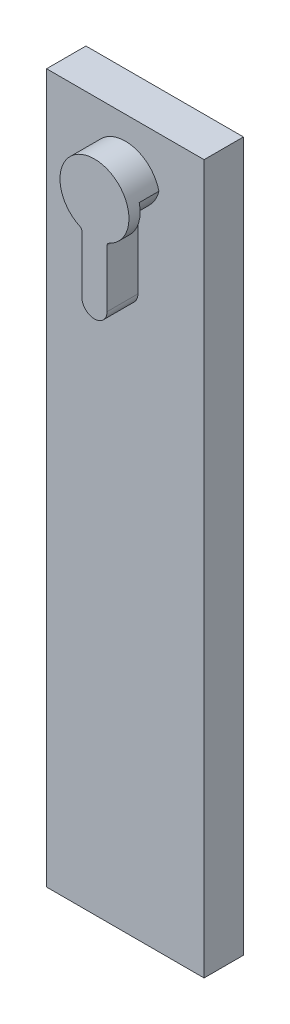
ISO-10303-21;
HEADER;
FILE_DESCRIPTION(('STEP AP214'),'2;1');
FILE_NAME('part.step','',(''),(''),'','','');
FILE_SCHEMA(('AUTOMOTIVE_DESIGN { 1 0 10303 214 1 1 1 1 }'));
ENDSEC;
DATA;
#1=APPLICATION_CONTEXT('core data for automotive mechanical design processes');
#2=APPLICATION_PROTOCOL_DEFINITION('international standard','automotive_design',2000,#1);
#3=PRODUCT_CONTEXT('',#1,'mechanical');
#4=PRODUCT('Part','Part','',(#3));
#5=PRODUCT_RELATED_PRODUCT_CATEGORY('part','',(#4));
#6=PRODUCT_DEFINITION_FORMATION('','',#4);
#7=PRODUCT_DEFINITION_CONTEXT('part definition',#1,'design');
#8=PRODUCT_DEFINITION('design','',#6,#7);
#9=PRODUCT_DEFINITION_SHAPE('','',#8);
#10=(LENGTH_UNIT() NAMED_UNIT(*) SI_UNIT(.MILLI.,.METRE.));
#11=(NAMED_UNIT(*) PLANE_ANGLE_UNIT() SI_UNIT($,.RADIAN.));
#12=(NAMED_UNIT(*) SI_UNIT($,.STERADIAN.) SOLID_ANGLE_UNIT());
#13=UNCERTAINTY_MEASURE_WITH_UNIT(LENGTH_MEASURE(1.E-05),#10,'distance_accuracy_value','');
#14=(GEOMETRIC_REPRESENTATION_CONTEXT(3) GLOBAL_UNCERTAINTY_ASSIGNED_CONTEXT((#13)) GLOBAL_UNIT_ASSIGNED_CONTEXT((#10,
#11,#12)) REPRESENTATION_CONTEXT('',''));
#15=CARTESIAN_POINT('',(0.,0.,0.));
#16=DIRECTION('',(0.,0.,1.));
#17=DIRECTION('',(1.,0.,0.));
#18=AXIS2_PLACEMENT_3D('',#15,#16,#17);
#19=CARTESIAN_POINT('',(12.7,107.5182,3.175));
#20=DIRECTION('',(0.,0.,-1.));
#21=DIRECTION('',(-1.,0.,0.));
#22=AXIS2_PLACEMENT_3D('',#19,#20,#21);
#23=CYLINDRICAL_SURFACE('',#22,5.5626);
#24=CARTESIAN_POINT('',(12.7,107.5182,3.175));
#25=DIRECTION('',(0.,0.,1.));
#26=DIRECTION('',(1.,0.,0.));
#27=AXIS2_PLACEMENT_3D('',#24,#25,#26);
#28=CIRCLE('',#27,5.5626);
#29=CARTESIAN_POINT('',(15.0274476987448,102.465922694704,3.175));
#30=VERTEX_POINT('',#29);
#31=CARTESIAN_POINT('',(18.1156826679561,106.2482,3.175));
#32=VERTEX_POINT('',#31);
#33=EDGE_CURVE('E230',#30,#32,#28,.T.);
#34=ORIENTED_EDGE('',*,*,#33,.F.);
#35=DIRECTION('',(0.,0.,-1.));
#36=VECTOR('',#35,1.);
#37=CARTESIAN_POINT('',(15.0274476987448,102.465922694704,3.175));
#38=LINE('',#37,#36);
#39=CARTESIAN_POINT('',(15.0274476987448,102.465922694704,0.));
#40=VERTEX_POINT('',#39);
#41=EDGE_CURVE('E210',#30,#40,#38,.T.);
#42=ORIENTED_EDGE('',*,*,#41,.T.);
#43=CARTESIAN_POINT('',(12.7,107.5182,0.));
#44=DIRECTION('',(0.,0.,-1.));
#45=DIRECTION('',(-1.,0.,0.));
#46=AXIS2_PLACEMENT_3D('',#43,#44,#45);
#47=CIRCLE('',#46,5.5626);
#48=CARTESIAN_POINT('',(18.1156826679561,106.2482,0.));
#49=VERTEX_POINT('',#48);
#50=EDGE_CURVE('E178',#40,#49,#47,.F.);
#51=ORIENTED_EDGE('',*,*,#50,.T.);
#52=DIRECTION('',(0.,0.,1.));
#53=VECTOR('',#52,1.);
#54=CARTESIAN_POINT('',(18.1156826679561,106.2482,2.487499978));
#55=LINE('',#54,#53);
#56=EDGE_CURVE('E160',#49,#32,#55,.T.);
#57=ORIENTED_EDGE('',*,*,#56,.T.);
#58=EDGE_LOOP('',(#34,#42,#51,#57));
#59=FACE_BOUND('',#58,.T.);
#60=ADVANCED_FACE('F39',(#59),#23,.T.);
#61=CARTESIAN_POINT('',(0.,0.,0.));
#62=DIRECTION('',(0.,0.,-1.));
#63=DIRECTION('',(-1.,0.,0.));
#64=AXIS2_PLACEMENT_3D('',#61,#62,#63);
#65=PLANE('',#64);
#66=DIRECTION('',(-1.,0.,0.));
#67=VECTOR('',#66,1.);
#68=CARTESIAN_POINT('',(0.,114.3,0.));
#69=LINE('',#68,#67);
#70=CARTESIAN_POINT('',(25.4,114.3,0.));
#71=VERTEX_POINT('',#70);
#72=CARTESIAN_POINT('',(0.,114.3,0.));
#73=VERTEX_POINT('',#72);
#74=EDGE_CURVE('E248',#71,#73,#69,.T.);
#75=ORIENTED_EDGE('',*,*,#74,.T.);
#76=DIRECTION('',(0.,-1.,0.));
#77=VECTOR('',#76,1.);
#78=CARTESIAN_POINT('',(0.,0.,0.));
#79=LINE('',#78,#77);
#80=CARTESIAN_POINT('',(0.,0.,0.));
#81=VERTEX_POINT('',#80);
#82=EDGE_CURVE('E243',#73,#81,#79,.T.);
#83=ORIENTED_EDGE('',*,*,#82,.T.);
#84=DIRECTION('',(1.,0.,0.));
#85=VECTOR('',#84,1.);
#86=CARTESIAN_POINT('',(0.,0.,0.));
#87=LINE('',#86,#85);
#88=CARTESIAN_POINT('',(25.4,0.,0.));
#89=VERTEX_POINT('',#88);
#90=EDGE_CURVE('E259',#81,#89,#87,.T.);
#91=ORIENTED_EDGE('',*,*,#90,.T.);
#92=DIRECTION('',(0.,1.,0.));
#93=VECTOR('',#92,1.);
#94=CARTESIAN_POINT('',(25.4,0.,0.));
#95=LINE('',#94,#93);
#96=EDGE_CURVE('E262',#89,#71,#95,.T.);
#97=ORIENTED_EDGE('',*,*,#96,.T.);
#98=EDGE_LOOP('',(#75,#83,#91,#97));
#99=FACE_BOUND('',#98,.T.);
#100=DIRECTION('',(0.,-1.,0.));
#101=VECTOR('',#100,1.);
#102=CARTESIAN_POINT('',(10.668,107.5182,0.));
#103=LINE('',#102,#101);
#104=CARTESIAN_POINT('',(10.668,102.004527507006,0.));
#105=VERTEX_POINT('',#104);
#106=CARTESIAN_POINT('',(10.668,90.2208,0.));
#107=VERTEX_POINT('',#106);
#108=EDGE_CURVE('E173',#105,#107,#103,.T.);
#109=ORIENTED_EDGE('',*,*,#108,.F.);
#110=CARTESIAN_POINT('',(10.16,102.004527507006,0.));
#111=DIRECTION('',(0.,0.,-1.));
#112=DIRECTION('',(-1.,0.,0.));
#113=AXIS2_PLACEMENT_3D('',#110,#111,#112);
#114=CIRCLE('',#113,0.508);
#115=CARTESIAN_POINT('',(10.3725523012552,102.465922694704,0.));
#116=VERTEX_POINT('',#115);
#117=EDGE_CURVE('E177',#105,#116,#114,.F.);
#118=ORIENTED_EDGE('',*,*,#117,.T.);
#119=CARTESIAN_POINT('',(7.28431733204391,106.2482,0.));
#120=VERTEX_POINT('',#119);
#121=EDGE_CURVE('E168',#120,#116,#47,.F.);
#122=ORIENTED_EDGE('',*,*,#121,.F.);
#123=CARTESIAN_POINT('',(12.7,104.9782,0.));
#124=DIRECTION('',(0.,0.,-1.));
#125=DIRECTION('',(-1.,0.,0.));
#126=AXIS2_PLACEMENT_3D('',#123,#124,#125);
#127=CIRCLE('',#126,5.56259999999999);
#128=EDGE_CURVE('E152',#120,#49,#127,.T.);
#129=ORIENTED_EDGE('',*,*,#128,.T.);
#130=ORIENTED_EDGE('',*,*,#50,.F.);
#131=CARTESIAN_POINT('',(15.24,102.004527507006,0.));
#132=DIRECTION('',(0.,0.,-1.));
#133=DIRECTION('',(-1.,0.,0.));
#134=AXIS2_PLACEMENT_3D('',#131,#132,#133);
#135=CIRCLE('',#134,0.508);
#136=CARTESIAN_POINT('',(14.732,102.004527507006,0.));
#137=VERTEX_POINT('',#136);
#138=EDGE_CURVE('E198',#40,#137,#135,.F.);
#139=ORIENTED_EDGE('',*,*,#138,.T.);
#140=DIRECTION('',(0.,1.,0.));
#141=VECTOR('',#140,1.);
#142=CARTESIAN_POINT('',(14.732,107.5182,0.));
#143=LINE('',#142,#141);
#144=CARTESIAN_POINT('',(14.732,90.2208,0.));
#145=VERTEX_POINT('',#144);
#146=EDGE_CURVE('E346',#145,#137,#143,.T.);
#147=ORIENTED_EDGE('',*,*,#146,.F.);
#148=CARTESIAN_POINT('',(12.7,90.2208,0.));
#149=DIRECTION('',(0.,0.,1.));
#150=DIRECTION('',(1.,0.,0.));
#151=AXIS2_PLACEMENT_3D('',#148,#149,#150);
#152=CIRCLE('',#151,2.032);
#153=EDGE_CURVE('E353',#107,#145,#152,.T.);
#154=ORIENTED_EDGE('',*,*,#153,.F.);
#155=EDGE_LOOP('',(#109,#118,#122,#129,#130,#139,#147,#154));
#156=FACE_BOUND('',#155,.T.);
#157=ADVANCED_FACE('F176',(#99,#156),#65,.F.);
#158=ORIENTED_EDGE('',*,*,#121,.T.);
#159=DIRECTION('',(0.,0.,-1.));
#160=VECTOR('',#159,1.);
#161=CARTESIAN_POINT('',(10.3725523012552,102.465922694704,3.175));
#162=LINE('',#161,#160);
#163=CARTESIAN_POINT('',(10.3725523012552,102.465922694704,3.175));
#164=VERTEX_POINT('',#163);
#165=EDGE_CURVE('E201',#116,#164,#162,.F.);
#166=ORIENTED_EDGE('',*,*,#165,.T.);
#167=CARTESIAN_POINT('',(7.28431733204391,106.2482,3.175));
#168=VERTEX_POINT('',#167);
#169=EDGE_CURVE('E171',#168,#164,#28,.T.);
#170=ORIENTED_EDGE('',*,*,#169,.F.);
#171=DIRECTION('',(0.,0.,1.));
#172=VECTOR('',#171,1.);
#173=CARTESIAN_POINT('',(7.28431733204391,106.2482,2.487499978));
#174=LINE('',#173,#172);
#175=EDGE_CURVE('E156',#168,#120,#174,.F.);
#176=ORIENTED_EDGE('',*,*,#175,.T.);
#177=EDGE_LOOP('',(#158,#166,#170,#176));
#178=FACE_BOUND('',#177,.T.);
#179=ADVANCED_FACE('F167',(#178),#23,.T.);
#180=CARTESIAN_POINT('',(12.7,104.9782,3.175));
#181=DIRECTION('',(0.,0.,1.));
#182=DIRECTION('',(1.,0.,0.));
#183=AXIS2_PLACEMENT_3D('',#180,#181,#182);
#184=PLANE('',#183);
#185=ORIENTED_EDGE('',*,*,#169,.T.);
#186=CARTESIAN_POINT('',(10.16,102.004527507006,3.175));
#187=DIRECTION('',(0.,0.,1.));
#188=DIRECTION('',(1.,0.,0.));
#189=AXIS2_PLACEMENT_3D('',#186,#187,#188);
#190=CIRCLE('',#189,0.508);
#191=CARTESIAN_POINT('',(10.668,102.004527507006,3.175));
#192=VERTEX_POINT('',#191);
#193=EDGE_CURVE('E203',#164,#192,#190,.F.);
#194=ORIENTED_EDGE('',*,*,#193,.T.);
#195=DIRECTION('',(0.,1.,0.));
#196=VECTOR('',#195,1.);
#197=CARTESIAN_POINT('',(10.668,104.9782,3.175));
#198=LINE('',#197,#196);
#199=CARTESIAN_POINT('',(10.668,99.4645275070059,3.175));
#200=VERTEX_POINT('',#199);
#201=EDGE_CURVE('E237',#200,#192,#198,.T.);
#202=ORIENTED_EDGE('',*,*,#201,.F.);
#203=CARTESIAN_POINT('',(10.16,99.4645275070059,3.175));
#204=DIRECTION('',(0.,0.,1.));
#205=DIRECTION('',(1.,0.,0.));
#206=AXIS2_PLACEMENT_3D('',#203,#204,#205);
#207=CIRCLE('',#206,0.508);
#208=CARTESIAN_POINT('',(10.3725523012552,99.9259226947041,3.175));
#209=VERTEX_POINT('',#208);
#210=EDGE_CURVE('E212',#200,#209,#207,.T.);
#211=ORIENTED_EDGE('',*,*,#210,.T.);
#212=CARTESIAN_POINT('',(12.7,104.9782,3.175));
#213=DIRECTION('',(0.,0.,1.));
#214=DIRECTION('',(1.,0.,0.));
#215=AXIS2_PLACEMENT_3D('',#212,#213,#214);
#216=CIRCLE('',#215,5.5626);
#217=EDGE_CURVE('E231',#168,#209,#216,.T.);
#218=ORIENTED_EDGE('',*,*,#217,.F.);
#219=EDGE_LOOP('',(#185,#194,#202,#211,#218));
#220=FACE_BOUND('',#219,.T.);
#221=ADVANCED_FACE('F305',(#220),#184,.F.);
#222=DIRECTION('',(0.,-1.,0.));
#223=VECTOR('',#222,1.);
#224=CARTESIAN_POINT('',(14.732,104.9782,3.175));
#225=LINE('',#224,#223);
#226=CARTESIAN_POINT('',(14.732,102.004527507006,3.175));
#227=VERTEX_POINT('',#226);
#228=CARTESIAN_POINT('',(14.732,99.4645275070059,3.175));
#229=VERTEX_POINT('',#228);
#230=EDGE_CURVE('E61',#227,#229,#225,.T.);
#231=ORIENTED_EDGE('',*,*,#230,.F.);
#232=CARTESIAN_POINT('',(15.24,102.004527507006,3.175));
#233=DIRECTION('',(0.,0.,1.));
#234=DIRECTION('',(1.,0.,0.));
#235=AXIS2_PLACEMENT_3D('',#232,#233,#234);
#236=CIRCLE('',#235,0.508);
#237=EDGE_CURVE('E54',#227,#30,#236,.F.);
#238=ORIENTED_EDGE('',*,*,#237,.T.);
#239=ORIENTED_EDGE('',*,*,#33,.T.);
#240=CARTESIAN_POINT('',(15.0274476987448,99.9259226947041,3.175));
#241=VERTEX_POINT('',#240);
#242=EDGE_CURVE('E236',#241,#32,#216,.T.);
#243=ORIENTED_EDGE('',*,*,#242,.F.);
#244=CARTESIAN_POINT('',(15.24,99.4645275070059,3.175));
#245=DIRECTION('',(0.,0.,1.));
#246=DIRECTION('',(1.,0.,0.));
#247=AXIS2_PLACEMENT_3D('',#244,#245,#246);
#248=CIRCLE('',#247,0.508);
#249=EDGE_CURVE('E11',#241,#229,#248,.T.);
#250=ORIENTED_EDGE('',*,*,#249,.T.);
#251=EDGE_LOOP('',(#231,#238,#239,#243,#250));
#252=FACE_BOUND('',#251,.T.);
#253=ADVANCED_FACE('F235',(#252),#184,.F.);
#254=CARTESIAN_POINT('',(12.7,104.9782,4.974999956));
#255=DIRECTION('',(0.,0.,-1.));
#256=DIRECTION('',(-1.,0.,0.));
#257=AXIS2_PLACEMENT_3D('',#254,#255,#256);
#258=CYLINDRICAL_SURFACE('',#257,5.5626);
#259=ORIENTED_EDGE('',*,*,#217,.T.);
#260=DIRECTION('',(0.,0.,-1.));
#261=VECTOR('',#260,1.);
#262=CARTESIAN_POINT('',(10.3725523012552,99.9259226947041,4.974999956));
#263=LINE('',#262,#261);
#264=CARTESIAN_POINT('',(10.3725523012552,99.9259226947041,4.974999956));
#265=VERTEX_POINT('',#264);
#266=EDGE_CURVE('E196',#209,#265,#263,.F.);
#267=ORIENTED_EDGE('',*,*,#266,.T.);
#268=CARTESIAN_POINT('',(12.7,104.9782,4.974999956));
#269=DIRECTION('',(0.,0.,1.));
#270=DIRECTION('',(1.,0.,0.));
#271=AXIS2_PLACEMENT_3D('',#268,#269,#270);
#272=CIRCLE('',#271,5.5626);
#273=CARTESIAN_POINT('',(15.0274476987448,99.9259226947041,4.974999956));
#274=VERTEX_POINT('',#273);
#275=EDGE_CURVE('E220',#274,#265,#272,.T.);
#276=ORIENTED_EDGE('',*,*,#275,.F.);
#277=DIRECTION('',(0.,0.,-1.));
#278=VECTOR('',#277,1.);
#279=CARTESIAN_POINT('',(15.0274476987448,99.9259226947041,4.974999956));
#280=LINE('',#279,#278);
#281=EDGE_CURVE('E194',#274,#241,#280,.T.);
#282=ORIENTED_EDGE('',*,*,#281,.T.);
#283=ORIENTED_EDGE('',*,*,#242,.T.);
#284=ORIENTED_EDGE('',*,*,#56,.F.);
#285=ORIENTED_EDGE('',*,*,#128,.F.);
#286=ORIENTED_EDGE('',*,*,#175,.F.);
#287=EDGE_LOOP('',(#259,#267,#276,#282,#283,#284,#285,#286));
#288=FACE_BOUND('',#287,.T.);
#289=ADVANCED_FACE('F155',(#288),#258,.T.);
#290=CARTESIAN_POINT('',(0.,0.,-6.35));
#291=DIRECTION('',(-1.,0.,0.));
#292=DIRECTION('',(0.,0.,1.));
#293=AXIS2_PLACEMENT_3D('',#290,#291,#292);
#294=PLANE('',#293);
#295=ORIENTED_EDGE('',*,*,#82,.F.);
#296=DIRECTION('',(0.,0.,1.));
#297=VECTOR('',#296,1.);
#298=CARTESIAN_POINT('',(0.,114.3,-6.35));
#299=LINE('',#298,#297);
#300=CARTESIAN_POINT('',(0.,114.3,-6.35));
#301=VERTEX_POINT('',#300);
#302=EDGE_CURVE('E179',#301,#73,#299,.T.);
#303=ORIENTED_EDGE('',*,*,#302,.F.);
#304=DIRECTION('',(0.,-1.,0.));
#305=VECTOR('',#304,1.);
#306=CARTESIAN_POINT('',(0.,0.,-6.35));
#307=LINE('',#306,#305);
#308=CARTESIAN_POINT('',(0.,0.,-6.35));
#309=VERTEX_POINT('',#308);
#310=EDGE_CURVE('E244',#301,#309,#307,.T.);
#311=ORIENTED_EDGE('',*,*,#310,.T.);
#312=DIRECTION('',(0.,0.,1.));
#313=VECTOR('',#312,1.);
#314=CARTESIAN_POINT('',(0.,0.,-6.35));
#315=LINE('',#314,#313);
#316=EDGE_CURVE('E187',#309,#81,#315,.T.);
#317=ORIENTED_EDGE('',*,*,#316,.T.);
#318=EDGE_LOOP('',(#295,#303,#311,#317));
#319=FACE_BOUND('',#318,.T.);
#320=ADVANCED_FACE('F272',(#319),#294,.T.);
#321=CARTESIAN_POINT('',(0.,114.3,-6.35));
#322=DIRECTION('',(0.,1.,0.));
#323=DIRECTION('',(0.,0.,1.));
#324=AXIS2_PLACEMENT_3D('',#321,#322,#323);
#325=PLANE('',#324);
#326=ORIENTED_EDGE('',*,*,#74,.F.);
#327=DIRECTION('',(0.,0.,1.));
#328=VECTOR('',#327,1.);
#329=CARTESIAN_POINT('',(25.4,114.3,-6.35));
#330=LINE('',#329,#328);
#331=CARTESIAN_POINT('',(25.4,114.3,-6.35));
#332=VERTEX_POINT('',#331);
#333=EDGE_CURVE('E183',#332,#71,#330,.T.);
#334=ORIENTED_EDGE('',*,*,#333,.F.);
#335=DIRECTION('',(-1.,0.,0.));
#336=VECTOR('',#335,1.);
#337=CARTESIAN_POINT('',(0.,114.3,-6.35));
#338=LINE('',#337,#336);
#339=EDGE_CURVE('E254',#332,#301,#338,.T.);
#340=ORIENTED_EDGE('',*,*,#339,.T.);
#341=ORIENTED_EDGE('',*,*,#302,.T.);
#342=EDGE_LOOP('',(#326,#334,#340,#341));
#343=FACE_BOUND('',#342,.T.);
#344=ADVANCED_FACE('F279',(#343),#325,.T.);
#345=CARTESIAN_POINT('',(25.4,0.,-6.35));
#346=DIRECTION('',(1.,0.,0.));
#347=DIRECTION('',(0.,0.,-1.));
#348=AXIS2_PLACEMENT_3D('',#345,#346,#347);
#349=PLANE('',#348);
#350=ORIENTED_EDGE('',*,*,#96,.F.);
#351=DIRECTION('',(0.,0.,1.));
#352=VECTOR('',#351,1.);
#353=CARTESIAN_POINT('',(25.4,0.,-6.35));
#354=LINE('',#353,#352);
#355=CARTESIAN_POINT('',(25.4,0.,-6.35));
#356=VERTEX_POINT('',#355);
#357=EDGE_CURVE('E266',#356,#89,#354,.T.);
#358=ORIENTED_EDGE('',*,*,#357,.F.);
#359=DIRECTION('',(0.,1.,0.));
#360=VECTOR('',#359,1.);
#361=CARTESIAN_POINT('',(25.4,0.,-6.35));
#362=LINE('',#361,#360);
#363=EDGE_CURVE('E251',#356,#332,#362,.T.);
#364=ORIENTED_EDGE('',*,*,#363,.T.);
#365=ORIENTED_EDGE('',*,*,#333,.T.);
#366=EDGE_LOOP('',(#350,#358,#364,#365));
#367=FACE_BOUND('',#366,.T.);
#368=ADVANCED_FACE('F285',(#367),#349,.T.);
#369=CARTESIAN_POINT('',(0.,0.,-6.35));
#370=DIRECTION('',(0.,-1.,0.));
#371=DIRECTION('',(0.,0.,-1.));
#372=AXIS2_PLACEMENT_3D('',#369,#370,#371);
#373=PLANE('',#372);
#374=ORIENTED_EDGE('',*,*,#90,.F.);
#375=ORIENTED_EDGE('',*,*,#316,.F.);
#376=DIRECTION('',(1.,0.,0.));
#377=VECTOR('',#376,1.);
#378=CARTESIAN_POINT('',(0.,0.,-6.35));
#379=LINE('',#378,#377);
#380=EDGE_CURVE('E247',#309,#356,#379,.T.);
#381=ORIENTED_EDGE('',*,*,#380,.T.);
#382=ORIENTED_EDGE('',*,*,#357,.T.);
#383=EDGE_LOOP('',(#374,#375,#381,#382));
#384=FACE_BOUND('',#383,.T.);
#385=ADVANCED_FACE('F275',(#384),#373,.T.);
#386=CARTESIAN_POINT('',(0.,0.,-6.35));
#387=DIRECTION('',(0.,0.,-1.));
#388=DIRECTION('',(-1.,0.,0.));
#389=AXIS2_PLACEMENT_3D('',#386,#387,#388);
#390=PLANE('',#389);
#391=ORIENTED_EDGE('',*,*,#310,.F.);
#392=ORIENTED_EDGE('',*,*,#339,.F.);
#393=ORIENTED_EDGE('',*,*,#363,.F.);
#394=ORIENTED_EDGE('',*,*,#380,.F.);
#395=EDGE_LOOP('',(#391,#392,#393,#394));
#396=FACE_BOUND('',#395,.T.);
#397=ADVANCED_FACE('F282',(#396),#390,.T.);
#398=CARTESIAN_POINT('',(12.7,104.9782,4.974999956));
#399=DIRECTION('',(0.,0.,1.));
#400=DIRECTION('',(1.,0.,0.));
#401=AXIS2_PLACEMENT_3D('',#398,#399,#400);
#402=PLANE('',#401);
#403=DIRECTION('',(0.,1.,0.));
#404=VECTOR('',#403,1.);
#405=CARTESIAN_POINT('',(14.732,107.5182,4.974999956));
#406=LINE('',#405,#404);
#407=CARTESIAN_POINT('',(14.732,90.2208,4.974999956));
#408=VERTEX_POINT('',#407);
#409=CARTESIAN_POINT('',(14.732,99.4645275070059,4.974999956));
#410=VERTEX_POINT('',#409);
#411=EDGE_CURVE('E224',#408,#410,#406,.T.);
#412=ORIENTED_EDGE('',*,*,#411,.T.);
#413=CARTESIAN_POINT('',(15.24,99.4645275070059,4.974999956));
#414=DIRECTION('',(0.,0.,1.));
#415=DIRECTION('',(1.,0.,0.));
#416=AXIS2_PLACEMENT_3D('',#413,#414,#415);
#417=CIRCLE('',#416,0.508);
#418=EDGE_CURVE('E47',#410,#274,#417,.F.);
#419=ORIENTED_EDGE('',*,*,#418,.T.);
#420=ORIENTED_EDGE('',*,*,#275,.T.);
#421=CARTESIAN_POINT('',(10.16,99.4645275070059,4.974999956));
#422=DIRECTION('',(0.,0.,1.));
#423=DIRECTION('',(1.,0.,0.));
#424=AXIS2_PLACEMENT_3D('',#421,#422,#423);
#425=CIRCLE('',#424,0.508);
#426=CARTESIAN_POINT('',(10.668,99.4645275070059,4.974999956));
#427=VERTEX_POINT('',#426);
#428=EDGE_CURVE('E214',#265,#427,#425,.F.);
#429=ORIENTED_EDGE('',*,*,#428,.T.);
#430=DIRECTION('',(0.,-1.,0.));
#431=VECTOR('',#430,1.);
#432=CARTESIAN_POINT('',(10.668,107.5182,4.974999956));
#433=LINE('',#432,#431);
#434=CARTESIAN_POINT('',(10.668,90.2208,4.974999956));
#435=VERTEX_POINT('',#434);
#436=EDGE_CURVE('E351',#427,#435,#433,.T.);
#437=ORIENTED_EDGE('',*,*,#436,.T.);
#438=CARTESIAN_POINT('',(12.7,90.2208,4.974999956));
#439=DIRECTION('',(0.,0.,1.));
#440=DIRECTION('',(1.,0.,0.));
#441=AXIS2_PLACEMENT_3D('',#438,#439,#440);
#442=CIRCLE('',#441,2.032);
#443=EDGE_CURVE('E360',#435,#408,#442,.T.);
#444=ORIENTED_EDGE('',*,*,#443,.T.);
#445=EDGE_LOOP('',(#412,#419,#420,#429,#437,#444));
#446=FACE_BOUND('',#445,.T.);
#447=ADVANCED_FACE('F219',(#446),#402,.T.);
#448=CARTESIAN_POINT('',(10.668,107.5182,26.7195511346286));
#449=DIRECTION('',(1.,0.,0.));
#450=DIRECTION('',(0.,1.,0.));
#451=AXIS2_PLACEMENT_3D('',#448,#449,#450);
#452=PLANE('',#451);
#453=ORIENTED_EDGE('',*,*,#436,.F.);
#454=DIRECTION('',(0.,0.,1.));
#455=VECTOR('',#454,1.);
#456=CARTESIAN_POINT('',(10.668,99.4645275070059,3.175));
#457=LINE('',#456,#455);
#458=EDGE_CURVE('E191',#427,#200,#457,.F.);
#459=ORIENTED_EDGE('',*,*,#458,.T.);
#460=ORIENTED_EDGE('',*,*,#201,.T.);
#461=DIRECTION('',(0.,0.,1.));
#462=VECTOR('',#461,1.);
#463=CARTESIAN_POINT('',(10.668,102.004527507006,0.));
#464=LINE('',#463,#462);
#465=EDGE_CURVE('E181',#192,#105,#464,.F.);
#466=ORIENTED_EDGE('',*,*,#465,.T.);
#467=ORIENTED_EDGE('',*,*,#108,.T.);
#468=DIRECTION('',(0.,0.,-1.));
#469=VECTOR('',#468,1.);
#470=CARTESIAN_POINT('',(10.668,90.2208,26.7195511346286));
#471=LINE('',#470,#469);
#472=EDGE_CURVE('E358',#435,#107,#471,.T.);
#473=ORIENTED_EDGE('',*,*,#472,.F.);
#474=EDGE_LOOP('',(#453,#459,#460,#466,#467,#473));
#475=FACE_BOUND('',#474,.T.);
#476=ADVANCED_FACE('F370',(#475),#452,.F.);
#477=CARTESIAN_POINT('',(14.732,107.5182,26.7195511346286));
#478=DIRECTION('',(-1.,0.,0.));
#479=DIRECTION('',(0.,0.,1.));
#480=AXIS2_PLACEMENT_3D('',#477,#478,#479);
#481=PLANE('',#480);
#482=ORIENTED_EDGE('',*,*,#230,.T.);
#483=DIRECTION('',(0.,0.,1.));
#484=VECTOR('',#483,1.);
#485=CARTESIAN_POINT('',(14.732,99.4645275070059,4.974999956));
#486=LINE('',#485,#484);
#487=EDGE_CURVE('E207',#229,#410,#486,.T.);
#488=ORIENTED_EDGE('',*,*,#487,.T.);
#489=ORIENTED_EDGE('',*,*,#411,.F.);
#490=DIRECTION('',(0.,0.,-1.));
#491=VECTOR('',#490,1.);
#492=CARTESIAN_POINT('',(14.732,90.2208,26.7195511346286));
#493=LINE('',#492,#491);
#494=EDGE_CURVE('E348',#408,#145,#493,.T.);
#495=ORIENTED_EDGE('',*,*,#494,.T.);
#496=ORIENTED_EDGE('',*,*,#146,.T.);
#497=DIRECTION('',(0.,0.,1.));
#498=VECTOR('',#497,1.);
#499=CARTESIAN_POINT('',(14.732,102.004527507006,3.175));
#500=LINE('',#499,#498);
#501=EDGE_CURVE('E205',#137,#227,#500,.T.);
#502=ORIENTED_EDGE('',*,*,#501,.T.);
#503=EDGE_LOOP('',(#482,#488,#489,#495,#496,#502));
#504=FACE_BOUND('',#503,.T.);
#505=ADVANCED_FACE('F347',(#504),#481,.F.);
#506=CARTESIAN_POINT('',(12.7,90.2208,26.7195511346286));
#507=DIRECTION('',(0.,0.,-1.));
#508=DIRECTION('',(-1.,0.,0.));
#509=AXIS2_PLACEMENT_3D('',#506,#507,#508);
#510=CYLINDRICAL_SURFACE('',#509,2.032);
#511=ORIENTED_EDGE('',*,*,#443,.F.);
#512=ORIENTED_EDGE('',*,*,#472,.T.);
#513=ORIENTED_EDGE('',*,*,#153,.T.);
#514=ORIENTED_EDGE('',*,*,#494,.F.);
#515=EDGE_LOOP('',(#511,#512,#513,#514));
#516=FACE_BOUND('',#515,.T.);
#517=ADVANCED_FACE('F329',(#516),#510,.T.);
#518=CARTESIAN_POINT('',(10.16,99.4645275070059,4.974999956));
#519=DIRECTION('',(0.,0.,-1.));
#520=DIRECTION('',(-1.,0.,0.));
#521=AXIS2_PLACEMENT_3D('',#518,#519,#520);
#522=CYLINDRICAL_SURFACE('',#521,0.508);
#523=ORIENTED_EDGE('',*,*,#428,.F.);
#524=ORIENTED_EDGE('',*,*,#266,.F.);
#525=ORIENTED_EDGE('',*,*,#210,.F.);
#526=ORIENTED_EDGE('',*,*,#458,.F.);
#527=EDGE_LOOP('',(#523,#524,#525,#526));
#528=FACE_BOUND('',#527,.T.);
#529=ADVANCED_FACE('F325',(#528),#522,.F.);
#530=CARTESIAN_POINT('',(10.16,102.004527507006,3.175));
#531=DIRECTION('',(0.,0.,-1.));
#532=DIRECTION('',(-1.,0.,0.));
#533=AXIS2_PLACEMENT_3D('',#530,#531,#532);
#534=CYLINDRICAL_SURFACE('',#533,0.508);
#535=ORIENTED_EDGE('',*,*,#193,.F.);
#536=ORIENTED_EDGE('',*,*,#165,.F.);
#537=ORIENTED_EDGE('',*,*,#117,.F.);
#538=ORIENTED_EDGE('',*,*,#465,.F.);
#539=EDGE_LOOP('',(#535,#536,#537,#538));
#540=FACE_BOUND('',#539,.T.);
#541=ADVANCED_FACE('F328',(#540),#534,.F.);
#542=CARTESIAN_POINT('',(15.24,99.4645275070059,4.974999956));
#543=DIRECTION('',(0.,0.,-1.));
#544=DIRECTION('',(-1.,0.,0.));
#545=AXIS2_PLACEMENT_3D('',#542,#543,#544);
#546=CYLINDRICAL_SURFACE('',#545,0.508);
#547=ORIENTED_EDGE('',*,*,#249,.F.);
#548=ORIENTED_EDGE('',*,*,#281,.F.);
#549=ORIENTED_EDGE('',*,*,#418,.F.);
#550=ORIENTED_EDGE('',*,*,#487,.F.);
#551=EDGE_LOOP('',(#547,#548,#549,#550));
#552=FACE_BOUND('',#551,.T.);
#553=ADVANCED_FACE('F234',(#552),#546,.F.);
#554=CARTESIAN_POINT('',(15.24,102.004527507006,3.175));
#555=DIRECTION('',(0.,0.,-1.));
#556=DIRECTION('',(-1.,0.,0.));
#557=AXIS2_PLACEMENT_3D('',#554,#555,#556);
#558=CYLINDRICAL_SURFACE('',#557,0.508);
#559=ORIENTED_EDGE('',*,*,#138,.F.);
#560=ORIENTED_EDGE('',*,*,#41,.F.);
#561=ORIENTED_EDGE('',*,*,#237,.F.);
#562=ORIENTED_EDGE('',*,*,#501,.F.);
#563=EDGE_LOOP('',(#559,#560,#561,#562));
#564=FACE_BOUND('',#563,.T.);
#565=ADVANCED_FACE('F41',(#564),#558,.F.);
#566=CLOSED_SHELL('',(#60,#157,#179,#221,#253,#289,#320,#344,#368,#385,#397,#447,#476,#505,#517,
#529,#541,#553,#565));
#567=MANIFOLD_SOLID_BREP('B2',#566);
#568=ADVANCED_BREP_SHAPE_REPRESENTATION('',(#18,#567),#14);
#569=SHAPE_DEFINITION_REPRESENTATION(#9,#568);
ENDSEC;
END-ISO-10303-21;
